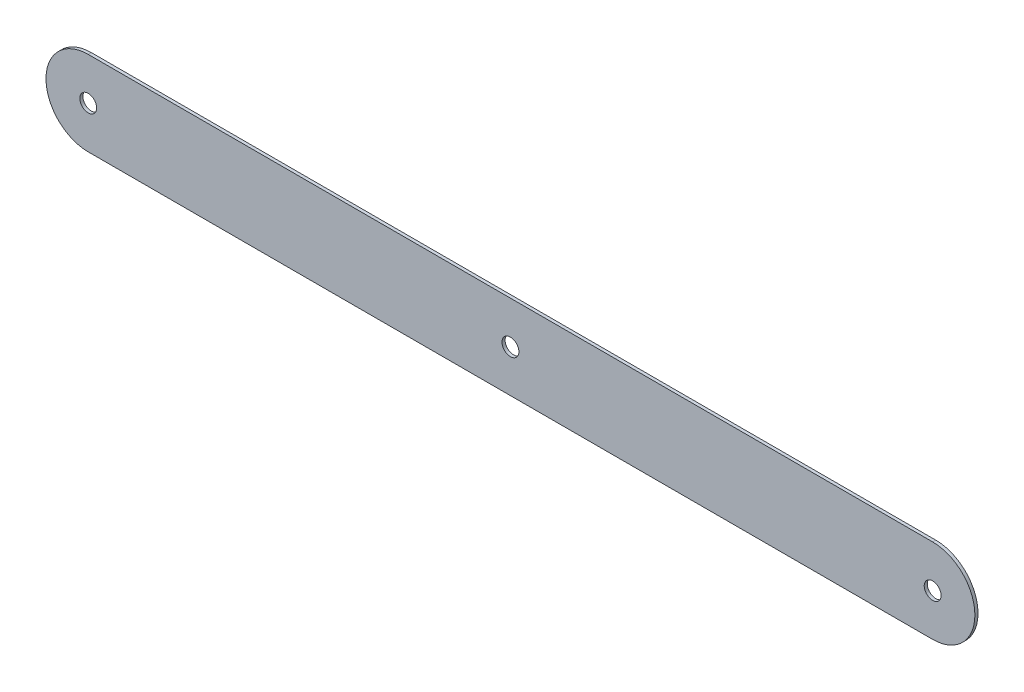
ISO-10303-21;
HEADER;
FILE_DESCRIPTION(('STEP AP214'),'2;1');
FILE_NAME('part.step','',(''),(''),'','','');
FILE_SCHEMA(('AUTOMOTIVE_DESIGN { 1 0 10303 214 1 1 1 1 }'));
ENDSEC;
DATA;
#1=APPLICATION_CONTEXT('core data for automotive mechanical design processes');
#2=APPLICATION_PROTOCOL_DEFINITION('international standard','automotive_design',2000,#1);
#3=PRODUCT_CONTEXT('',#1,'mechanical');
#4=PRODUCT('Part','Part','',(#3));
#5=PRODUCT_RELATED_PRODUCT_CATEGORY('part','',(#4));
#6=PRODUCT_DEFINITION_FORMATION('','',#4);
#7=PRODUCT_DEFINITION_CONTEXT('part definition',#1,'design');
#8=PRODUCT_DEFINITION('design','',#6,#7);
#9=PRODUCT_DEFINITION_SHAPE('','',#8);
#10=(LENGTH_UNIT() NAMED_UNIT(*) SI_UNIT(.MILLI.,.METRE.));
#11=(NAMED_UNIT(*) PLANE_ANGLE_UNIT() SI_UNIT($,.RADIAN.));
#12=(NAMED_UNIT(*) SI_UNIT($,.STERADIAN.) SOLID_ANGLE_UNIT());
#13=UNCERTAINTY_MEASURE_WITH_UNIT(LENGTH_MEASURE(1.E-05),#10,'distance_accuracy_value','');
#14=(GEOMETRIC_REPRESENTATION_CONTEXT(3) GLOBAL_UNCERTAINTY_ASSIGNED_CONTEXT((#13)) GLOBAL_UNIT_ASSIGNED_CONTEXT((#10,
#11,#12)) REPRESENTATION_CONTEXT('',''));
#15=CARTESIAN_POINT('',(0.,0.,0.));
#16=DIRECTION('',(0.,0.,1.));
#17=DIRECTION('',(1.,0.,0.));
#18=AXIS2_PLACEMENT_3D('',#15,#16,#17);
#19=CARTESIAN_POINT('',(-28.3444816053512,0.,-0.7366));
#20=DIRECTION('',(0.,0.,1.));
#21=DIRECTION('',(1.,0.,0.));
#22=AXIS2_PLACEMENT_3D('',#19,#20,#21);
#23=CYLINDRICAL_SURFACE('',#22,10.);
#24=CARTESIAN_POINT('',(-28.3444816053512,0.,0.));
#25=DIRECTION('',(0.,0.,1.));
#26=DIRECTION('',(1.,0.,0.));
#27=AXIS2_PLACEMENT_3D('',#24,#25,#26);
#28=CIRCLE('',#27,10.);
#29=CARTESIAN_POINT('',(-28.3444816053512,10.,0.));
#30=VERTEX_POINT('',#29);
#31=CARTESIAN_POINT('',(-28.3444816053512,-10.,0.));
#32=VERTEX_POINT('',#31);
#33=EDGE_CURVE('E100',#30,#32,#28,.T.);
#34=ORIENTED_EDGE('',*,*,#33,.F.);
#35=DIRECTION('',(0.,0.,1.));
#36=VECTOR('',#35,1.);
#37=CARTESIAN_POINT('',(-28.3444816053512,10.,-0.7366));
#38=LINE('',#37,#36);
#39=CARTESIAN_POINT('',(-28.3444816053512,10.,-0.7366));
#40=VERTEX_POINT('',#39);
#41=EDGE_CURVE('E11',#40,#30,#38,.T.);
#42=ORIENTED_EDGE('',*,*,#41,.F.);
#43=CARTESIAN_POINT('',(-28.3444816053512,0.,-0.7366));
#44=DIRECTION('',(0.,0.,1.));
#45=DIRECTION('',(1.,0.,0.));
#46=AXIS2_PLACEMENT_3D('',#43,#44,#45);
#47=CIRCLE('',#46,10.);
#48=CARTESIAN_POINT('',(-28.3444816053512,-10.,-0.7366));
#49=VERTEX_POINT('',#48);
#50=EDGE_CURVE('E93',#40,#49,#47,.T.);
#51=ORIENTED_EDGE('',*,*,#50,.T.);
#52=DIRECTION('',(0.,0.,1.));
#53=VECTOR('',#52,1.);
#54=CARTESIAN_POINT('',(-28.3444816053512,-10.,-0.7366));
#55=LINE('',#54,#53);
#56=EDGE_CURVE('E38',#49,#32,#55,.T.);
#57=ORIENTED_EDGE('',*,*,#56,.T.);
#58=EDGE_LOOP('',(#34,#42,#51,#57));
#59=FACE_BOUND('',#58,.T.);
#60=ADVANCED_FACE('F35',(#59),#23,.T.);
#61=CARTESIAN_POINT('',(-28.3444816053512,10.,-0.7366));
#62=DIRECTION('',(0.,1.,0.));
#63=DIRECTION('',(0.,0.,1.));
#64=AXIS2_PLACEMENT_3D('',#61,#62,#63);
#65=PLANE('',#64);
#66=DIRECTION('',(-1.,0.,0.));
#67=VECTOR('',#66,1.);
#68=CARTESIAN_POINT('',(-28.3444816053512,10.,0.));
#69=LINE('',#68,#67);
#70=CARTESIAN_POINT('',(171.655518394649,10.,0.));
#71=VERTEX_POINT('',#70);
#72=EDGE_CURVE('E95',#71,#30,#69,.T.);
#73=ORIENTED_EDGE('',*,*,#72,.F.);
#74=DIRECTION('',(0.,0.,1.));
#75=VECTOR('',#74,1.);
#76=CARTESIAN_POINT('',(171.655518394649,10.,-0.7366));
#77=LINE('',#76,#75);
#78=CARTESIAN_POINT('',(171.655518394649,10.,-0.7366));
#79=VERTEX_POINT('',#78);
#80=EDGE_CURVE('E44',#79,#71,#77,.T.);
#81=ORIENTED_EDGE('',*,*,#80,.F.);
#82=DIRECTION('',(-1.,0.,0.));
#83=VECTOR('',#82,1.);
#84=CARTESIAN_POINT('',(-28.3444816053512,10.,-0.7366));
#85=LINE('',#84,#83);
#86=EDGE_CURVE('E90',#79,#40,#85,.T.);
#87=ORIENTED_EDGE('',*,*,#86,.T.);
#88=ORIENTED_EDGE('',*,*,#41,.T.);
#89=EDGE_LOOP('',(#73,#81,#87,#88));
#90=FACE_BOUND('',#89,.T.);
#91=ADVANCED_FACE('F111',(#90),#65,.T.);
#92=CARTESIAN_POINT('',(171.655518394649,0.,-0.7366));
#93=DIRECTION('',(0.,0.,1.));
#94=DIRECTION('',(1.,0.,0.));
#95=AXIS2_PLACEMENT_3D('',#92,#93,#94);
#96=CYLINDRICAL_SURFACE('',#95,10.);
#97=CARTESIAN_POINT('',(171.655518394649,0.,0.));
#98=DIRECTION('',(0.,0.,1.));
#99=DIRECTION('',(1.,0.,0.));
#100=AXIS2_PLACEMENT_3D('',#97,#98,#99);
#101=CIRCLE('',#100,10.);
#102=CARTESIAN_POINT('',(171.655518394649,-10.,0.));
#103=VERTEX_POINT('',#102);
#104=EDGE_CURVE('E85',#103,#71,#101,.T.);
#105=ORIENTED_EDGE('',*,*,#104,.F.);
#106=DIRECTION('',(0.,0.,1.));
#107=VECTOR('',#106,1.);
#108=CARTESIAN_POINT('',(171.655518394649,-10.,-0.7366));
#109=LINE('',#108,#107);
#110=CARTESIAN_POINT('',(171.655518394649,-10.,-0.7366));
#111=VERTEX_POINT('',#110);
#112=EDGE_CURVE('E80',#111,#103,#109,.T.);
#113=ORIENTED_EDGE('',*,*,#112,.F.);
#114=CARTESIAN_POINT('',(171.655518394649,0.,-0.7366));
#115=DIRECTION('',(0.,0.,1.));
#116=DIRECTION('',(1.,0.,0.));
#117=AXIS2_PLACEMENT_3D('',#114,#115,#116);
#118=CIRCLE('',#117,10.);
#119=EDGE_CURVE('E83',#111,#79,#118,.T.);
#120=ORIENTED_EDGE('',*,*,#119,.T.);
#121=ORIENTED_EDGE('',*,*,#80,.T.);
#122=EDGE_LOOP('',(#105,#113,#120,#121));
#123=FACE_BOUND('',#122,.T.);
#124=ADVANCED_FACE('F82',(#123),#96,.T.);
#125=CARTESIAN_POINT('',(-28.3444816053512,-10.,-0.7366));
#126=DIRECTION('',(0.,-1.,0.));
#127=DIRECTION('',(0.,0.,-1.));
#128=AXIS2_PLACEMENT_3D('',#125,#126,#127);
#129=PLANE('',#128);
#130=DIRECTION('',(1.,0.,0.));
#131=VECTOR('',#130,1.);
#132=CARTESIAN_POINT('',(-28.3444816053512,-10.,0.));
#133=LINE('',#132,#131);
#134=EDGE_CURVE('E103',#32,#103,#133,.T.);
#135=ORIENTED_EDGE('',*,*,#134,.F.);
#136=ORIENTED_EDGE('',*,*,#56,.F.);
#137=DIRECTION('',(1.,0.,0.));
#138=VECTOR('',#137,1.);
#139=CARTESIAN_POINT('',(-28.3444816053512,-10.,-0.7366));
#140=LINE('',#139,#138);
#141=EDGE_CURVE('E89',#49,#111,#140,.T.);
#142=ORIENTED_EDGE('',*,*,#141,.T.);
#143=ORIENTED_EDGE('',*,*,#112,.T.);
#144=EDGE_LOOP('',(#135,#136,#142,#143));
#145=FACE_BOUND('',#144,.T.);
#146=ADVANCED_FACE('F92',(#145),#129,.T.);
#147=CARTESIAN_POINT('',(-28.3444816053512,0.,-0.7366));
#148=DIRECTION('',(0.,0.,1.));
#149=DIRECTION('',(1.,0.,0.));
#150=AXIS2_PLACEMENT_3D('',#147,#148,#149);
#151=PLANE('',#150);
#152=CARTESIAN_POINT('',(71.6555183946488,0.,-0.7366));
#153=DIRECTION('',(0.,0.,1.));
#154=DIRECTION('',(1.,0.,0.));
#155=AXIS2_PLACEMENT_3D('',#152,#153,#154);
#156=CIRCLE('',#155,2.);
#157=CARTESIAN_POINT('',(73.6555183946489,0.,-0.7366));
#158=VERTEX_POINT('',#157);
#159=EDGE_CURVE('E148',#158,#158,#156,.T.);
#160=ORIENTED_EDGE('',*,*,#159,.T.);
#161=EDGE_LOOP('',(#160));
#162=FACE_BOUND('',#161,.T.);
#163=CARTESIAN_POINT('',(171.655518394649,0.,-0.7366));
#164=DIRECTION('',(0.,0.,1.));
#165=DIRECTION('',(1.,0.,0.));
#166=AXIS2_PLACEMENT_3D('',#163,#164,#165);
#167=CIRCLE('',#166,2.);
#168=CARTESIAN_POINT('',(173.655518394649,0.,-0.7366));
#169=VERTEX_POINT('',#168);
#170=EDGE_CURVE('E156',#169,#169,#167,.T.);
#171=ORIENTED_EDGE('',*,*,#170,.T.);
#172=EDGE_LOOP('',(#171));
#173=FACE_BOUND('',#172,.T.);
#174=CARTESIAN_POINT('',(-28.3444816053512,0.,-0.7366));
#175=DIRECTION('',(0.,0.,1.));
#176=DIRECTION('',(1.,0.,0.));
#177=AXIS2_PLACEMENT_3D('',#174,#175,#176);
#178=CIRCLE('',#177,2.);
#179=CARTESIAN_POINT('',(-26.3444816053512,0.,-0.7366));
#180=VERTEX_POINT('',#179);
#181=EDGE_CURVE('E104',#180,#180,#178,.T.);
#182=ORIENTED_EDGE('',*,*,#181,.T.);
#183=EDGE_LOOP('',(#182));
#184=FACE_BOUND('',#183,.T.);
#185=ORIENTED_EDGE('',*,*,#50,.F.);
#186=ORIENTED_EDGE('',*,*,#86,.F.);
#187=ORIENTED_EDGE('',*,*,#119,.F.);
#188=ORIENTED_EDGE('',*,*,#141,.F.);
#189=EDGE_LOOP('',(#185,#186,#187,#188));
#190=FACE_BOUND('',#189,.T.);
#191=ADVANCED_FACE('F88',(#162,#173,#184,#190),#151,.F.);
#192=CARTESIAN_POINT('',(-28.3444816053512,0.,0.));
#193=DIRECTION('',(0.,0.,1.));
#194=DIRECTION('',(1.,0.,0.));
#195=AXIS2_PLACEMENT_3D('',#192,#193,#194);
#196=PLANE('',#195);
#197=CARTESIAN_POINT('',(71.6555183946488,0.,0.));
#198=DIRECTION('',(0.,0.,1.));
#199=DIRECTION('',(1.,0.,0.));
#200=AXIS2_PLACEMENT_3D('',#197,#198,#199);
#201=CIRCLE('',#200,2.);
#202=CARTESIAN_POINT('',(73.6555183946489,0.,0.));
#203=VERTEX_POINT('',#202);
#204=EDGE_CURVE('E151',#203,#203,#201,.T.);
#205=ORIENTED_EDGE('',*,*,#204,.F.);
#206=EDGE_LOOP('',(#205));
#207=FACE_BOUND('',#206,.T.);
#208=CARTESIAN_POINT('',(171.655518394649,0.,0.));
#209=DIRECTION('',(0.,0.,1.));
#210=DIRECTION('',(1.,0.,0.));
#211=AXIS2_PLACEMENT_3D('',#208,#209,#210);
#212=CIRCLE('',#211,2.);
#213=CARTESIAN_POINT('',(173.655518394649,0.,0.));
#214=VERTEX_POINT('',#213);
#215=EDGE_CURVE('E153',#214,#214,#212,.T.);
#216=ORIENTED_EDGE('',*,*,#215,.F.);
#217=EDGE_LOOP('',(#216));
#218=FACE_BOUND('',#217,.T.);
#219=CARTESIAN_POINT('',(-28.3444816053512,0.,0.));
#220=DIRECTION('',(0.,0.,1.));
#221=DIRECTION('',(1.,0.,0.));
#222=AXIS2_PLACEMENT_3D('',#219,#220,#221);
#223=CIRCLE('',#222,2.);
#224=CARTESIAN_POINT('',(-26.3444816053512,0.,0.));
#225=VERTEX_POINT('',#224);
#226=EDGE_CURVE('E159',#225,#225,#223,.T.);
#227=ORIENTED_EDGE('',*,*,#226,.F.);
#228=EDGE_LOOP('',(#227));
#229=FACE_BOUND('',#228,.T.);
#230=ORIENTED_EDGE('',*,*,#33,.T.);
#231=ORIENTED_EDGE('',*,*,#134,.T.);
#232=ORIENTED_EDGE('',*,*,#104,.T.);
#233=ORIENTED_EDGE('',*,*,#72,.T.);
#234=EDGE_LOOP('',(#230,#231,#232,#233));
#235=FACE_BOUND('',#234,.T.);
#236=ADVANCED_FACE('F110',(#207,#218,#229,#235),#196,.T.);
#237=CARTESIAN_POINT('',(-28.3444816053512,0.,-0.7366));
#238=DIRECTION('',(0.,0.,1.));
#239=DIRECTION('',(1.,0.,0.));
#240=AXIS2_PLACEMENT_3D('',#237,#238,#239);
#241=CYLINDRICAL_SURFACE('',#240,2.);
#242=ORIENTED_EDGE('',*,*,#181,.F.);
#243=EDGE_LOOP('',(#242));
#244=FACE_BOUND('',#243,.T.);
#245=ORIENTED_EDGE('',*,*,#226,.T.);
#246=EDGE_LOOP('',(#245));
#247=FACE_BOUND('',#246,.T.);
#248=ADVANCED_FACE('F129',(#244,#247),#241,.F.);
#249=CARTESIAN_POINT('',(171.655518394649,0.,-0.7366));
#250=DIRECTION('',(0.,0.,1.));
#251=DIRECTION('',(1.,0.,0.));
#252=AXIS2_PLACEMENT_3D('',#249,#250,#251);
#253=CYLINDRICAL_SURFACE('',#252,2.);
#254=ORIENTED_EDGE('',*,*,#170,.F.);
#255=EDGE_LOOP('',(#254));
#256=FACE_BOUND('',#255,.T.);
#257=ORIENTED_EDGE('',*,*,#215,.T.);
#258=EDGE_LOOP('',(#257));
#259=FACE_BOUND('',#258,.T.);
#260=ADVANCED_FACE('F136',(#256,#259),#253,.F.);
#261=CARTESIAN_POINT('',(71.6555183946488,0.,-0.7366));
#262=DIRECTION('',(0.,0.,1.));
#263=DIRECTION('',(1.,0.,0.));
#264=AXIS2_PLACEMENT_3D('',#261,#262,#263);
#265=CYLINDRICAL_SURFACE('',#264,2.);
#266=ORIENTED_EDGE('',*,*,#159,.F.);
#267=EDGE_LOOP('',(#266));
#268=FACE_BOUND('',#267,.T.);
#269=ORIENTED_EDGE('',*,*,#204,.T.);
#270=EDGE_LOOP('',(#269));
#271=FACE_BOUND('',#270,.T.);
#272=ADVANCED_FACE('F140',(#268,#271),#265,.F.);
#273=CLOSED_SHELL('',(#60,#91,#124,#146,#191,#236,#248,#260,#272));
#274=MANIFOLD_SOLID_BREP('B2',#273);
#275=ADVANCED_BREP_SHAPE_REPRESENTATION('',(#18,#274),#14);
#276=SHAPE_DEFINITION_REPRESENTATION(#9,#275);
ENDSEC;
END-ISO-10303-21;
